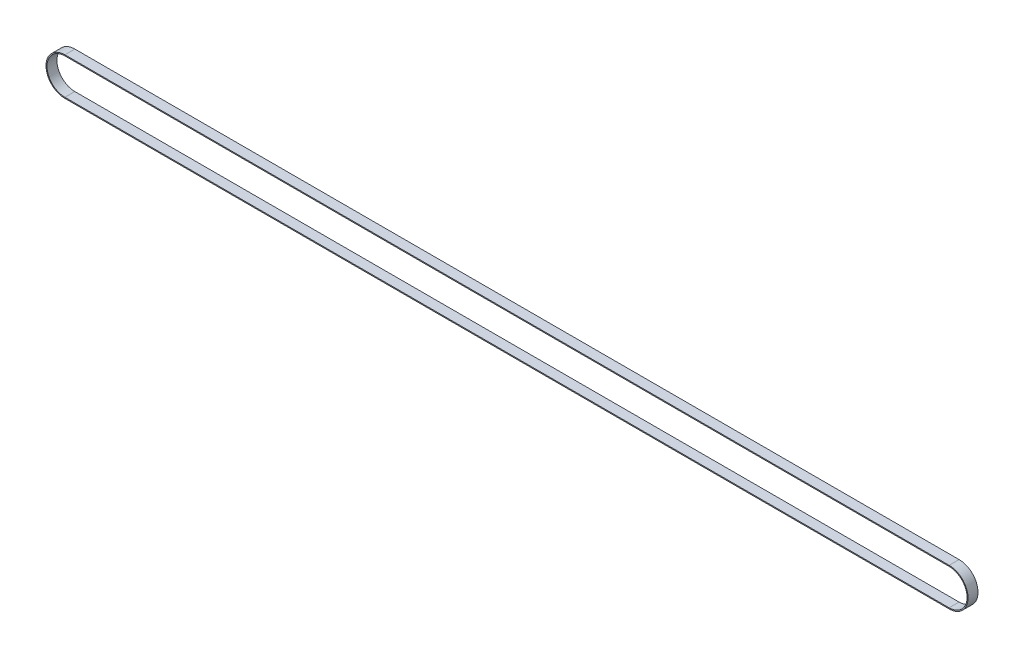
ISO-10303-21;
HEADER;
FILE_DESCRIPTION(('STEP AP214'),'2;1');
FILE_NAME('part.step','',(''),(''),'','','');
FILE_SCHEMA(('AUTOMOTIVE_DESIGN { 1 0 10303 214 1 1 1 1 }'));
ENDSEC;
DATA;
#1=APPLICATION_CONTEXT('core data for automotive mechanical design processes');
#2=APPLICATION_PROTOCOL_DEFINITION('international standard','automotive_design',2000,#1);
#3=PRODUCT_CONTEXT('',#1,'mechanical');
#4=PRODUCT('Part','Part','',(#3));
#5=PRODUCT_RELATED_PRODUCT_CATEGORY('part','',(#4));
#6=PRODUCT_DEFINITION_FORMATION('','',#4);
#7=PRODUCT_DEFINITION_CONTEXT('part definition',#1,'design');
#8=PRODUCT_DEFINITION('design','',#6,#7);
#9=PRODUCT_DEFINITION_SHAPE('','',#8);
#10=(LENGTH_UNIT() NAMED_UNIT(*) SI_UNIT(.MILLI.,.METRE.));
#11=(NAMED_UNIT(*) PLANE_ANGLE_UNIT() SI_UNIT($,.RADIAN.));
#12=(NAMED_UNIT(*) SI_UNIT($,.STERADIAN.) SOLID_ANGLE_UNIT());
#13=UNCERTAINTY_MEASURE_WITH_UNIT(LENGTH_MEASURE(1.E-05),#10,'distance_accuracy_value','');
#14=(GEOMETRIC_REPRESENTATION_CONTEXT(3) GLOBAL_UNCERTAINTY_ASSIGNED_CONTEXT((#13)) GLOBAL_UNIT_ASSIGNED_CONTEXT((#10,
#11,#12)) REPRESENTATION_CONTEXT('',''));
#15=CARTESIAN_POINT('',(0.,0.,0.));
#16=DIRECTION('',(0.,0.,1.));
#17=DIRECTION('',(1.,0.,0.));
#18=AXIS2_PLACEMENT_3D('',#15,#16,#17);
#19=CARTESIAN_POINT('',(0.,0.,10.));
#20=DIRECTION('',(0.,0.,1.));
#21=DIRECTION('',(1.,0.,0.));
#22=AXIS2_PLACEMENT_3D('',#19,#20,#21);
#23=PLANE('',#22);
#24=CARTESIAN_POINT('',(0.,0.,10.));
#25=DIRECTION('',(0.,0.,1.));
#26=DIRECTION('',(1.,0.,0.));
#27=AXIS2_PLACEMENT_3D('',#24,#25,#26);
#28=CIRCLE('',#27,19.);
#29=CARTESIAN_POINT('',(0.,19.,10.));
#30=VERTEX_POINT('',#29);
#31=CARTESIAN_POINT('',(0.,-19.,10.));
#32=VERTEX_POINT('',#31);
#33=EDGE_CURVE('E157',#30,#32,#28,.T.);
#34=ORIENTED_EDGE('',*,*,#33,.T.);
#35=DIRECTION('',(1.,0.,0.));
#36=VECTOR('',#35,1.);
#37=CARTESIAN_POINT('',(0.,-19.,10.));
#38=LINE('',#37,#36);
#39=CARTESIAN_POINT('',(889.,-19.,10.));
#40=VERTEX_POINT('',#39);
#41=EDGE_CURVE('E161',#32,#40,#38,.T.);
#42=ORIENTED_EDGE('',*,*,#41,.T.);
#43=CARTESIAN_POINT('',(889.,0.,10.));
#44=DIRECTION('',(0.,0.,1.));
#45=DIRECTION('',(1.,0.,0.));
#46=AXIS2_PLACEMENT_3D('',#43,#44,#45);
#47=CIRCLE('',#46,19.);
#48=CARTESIAN_POINT('',(889.,19.,10.));
#49=VERTEX_POINT('',#48);
#50=EDGE_CURVE('E165',#40,#49,#47,.T.);
#51=ORIENTED_EDGE('',*,*,#50,.T.);
#52=DIRECTION('',(-1.,0.,0.));
#53=VECTOR('',#52,1.);
#54=CARTESIAN_POINT('',(889.,19.,10.));
#55=LINE('',#54,#53);
#56=EDGE_CURVE('E168',#49,#30,#55,.T.);
#57=ORIENTED_EDGE('',*,*,#56,.T.);
#58=EDGE_LOOP('',(#34,#42,#51,#57));
#59=FACE_BOUND('',#58,.T.);
#60=DIRECTION('',(-1.,0.,0.));
#61=VECTOR('',#60,1.);
#62=CARTESIAN_POINT('',(889.,18.,10.));
#63=LINE('',#62,#61);
#64=CARTESIAN_POINT('',(889.,18.,10.));
#65=VERTEX_POINT('',#64);
#66=CARTESIAN_POINT('',(0.,18.,10.));
#67=VERTEX_POINT('',#66);
#68=EDGE_CURVE('E118',#65,#67,#63,.T.);
#69=ORIENTED_EDGE('',*,*,#68,.F.);
#70=CARTESIAN_POINT('',(889.,0.,10.));
#71=DIRECTION('',(0.,0.,1.));
#72=DIRECTION('',(1.,0.,0.));
#73=AXIS2_PLACEMENT_3D('',#70,#71,#72);
#74=CIRCLE('',#73,18.);
#75=CARTESIAN_POINT('',(889.,-18.,10.));
#76=VERTEX_POINT('',#75);
#77=EDGE_CURVE('E109',#76,#65,#74,.T.);
#78=ORIENTED_EDGE('',*,*,#77,.F.);
#79=DIRECTION('',(1.,0.,0.));
#80=VECTOR('',#79,1.);
#81=CARTESIAN_POINT('',(0.,-18.,10.));
#82=LINE('',#81,#80);
#83=CARTESIAN_POINT('',(0.,-18.,10.));
#84=VERTEX_POINT('',#83);
#85=EDGE_CURVE('E135',#84,#76,#82,.T.);
#86=ORIENTED_EDGE('',*,*,#85,.F.);
#87=CARTESIAN_POINT('',(0.,0.,10.));
#88=DIRECTION('',(0.,0.,1.));
#89=DIRECTION('',(1.,0.,0.));
#90=AXIS2_PLACEMENT_3D('',#87,#88,#89);
#91=CIRCLE('',#90,18.);
#92=EDGE_CURVE('E131',#67,#84,#91,.T.);
#93=ORIENTED_EDGE('',*,*,#92,.F.);
#94=EDGE_LOOP('',(#69,#78,#86,#93));
#95=FACE_BOUND('',#94,.T.);
#96=ADVANCED_FACE('F43',(#59,#95),#23,.T.);
#97=CARTESIAN_POINT('',(0.,0.,0.));
#98=DIRECTION('',(0.,0.,1.));
#99=DIRECTION('',(1.,0.,0.));
#100=AXIS2_PLACEMENT_3D('',#97,#98,#99);
#101=PLANE('',#100);
#102=CARTESIAN_POINT('',(0.,0.,0.));
#103=DIRECTION('',(0.,0.,1.));
#104=DIRECTION('',(1.,0.,0.));
#105=AXIS2_PLACEMENT_3D('',#102,#103,#104);
#106=CIRCLE('',#105,19.);
#107=CARTESIAN_POINT('',(0.,19.,0.));
#108=VERTEX_POINT('',#107);
#109=CARTESIAN_POINT('',(0.,-19.,0.));
#110=VERTEX_POINT('',#109);
#111=EDGE_CURVE('E127',#108,#110,#106,.T.);
#112=ORIENTED_EDGE('',*,*,#111,.F.);
#113=DIRECTION('',(-1.,0.,0.));
#114=VECTOR('',#113,1.);
#115=CARTESIAN_POINT('',(889.,19.,0.));
#116=LINE('',#115,#114);
#117=CARTESIAN_POINT('',(889.,19.,0.));
#118=VERTEX_POINT('',#117);
#119=EDGE_CURVE('E162',#118,#108,#116,.T.);
#120=ORIENTED_EDGE('',*,*,#119,.F.);
#121=CARTESIAN_POINT('',(889.,0.,0.));
#122=DIRECTION('',(0.,0.,1.));
#123=DIRECTION('',(1.,0.,0.));
#124=AXIS2_PLACEMENT_3D('',#121,#122,#123);
#125=CIRCLE('',#124,19.);
#126=CARTESIAN_POINT('',(889.,-19.,0.));
#127=VERTEX_POINT('',#126);
#128=EDGE_CURVE('E178',#127,#118,#125,.T.);
#129=ORIENTED_EDGE('',*,*,#128,.F.);
#130=DIRECTION('',(1.,0.,0.));
#131=VECTOR('',#130,1.);
#132=CARTESIAN_POINT('',(0.,-19.,0.));
#133=LINE('',#132,#131);
#134=EDGE_CURVE('E175',#110,#127,#133,.T.);
#135=ORIENTED_EDGE('',*,*,#134,.F.);
#136=EDGE_LOOP('',(#112,#120,#129,#135));
#137=FACE_BOUND('',#136,.T.);
#138=CARTESIAN_POINT('',(889.,0.,0.));
#139=DIRECTION('',(0.,0.,1.));
#140=DIRECTION('',(1.,0.,0.));
#141=AXIS2_PLACEMENT_3D('',#138,#139,#140);
#142=CIRCLE('',#141,18.);
#143=CARTESIAN_POINT('',(889.,-18.,0.));
#144=VERTEX_POINT('',#143);
#145=CARTESIAN_POINT('',(889.,18.,0.));
#146=VERTEX_POINT('',#145);
#147=EDGE_CURVE('E67',#144,#146,#142,.T.);
#148=ORIENTED_EDGE('',*,*,#147,.T.);
#149=DIRECTION('',(-1.,0.,0.));
#150=VECTOR('',#149,1.);
#151=CARTESIAN_POINT('',(889.,18.,0.));
#152=LINE('',#151,#150);
#153=CARTESIAN_POINT('',(0.,18.,0.));
#154=VERTEX_POINT('',#153);
#155=EDGE_CURVE('E125',#146,#154,#152,.T.);
#156=ORIENTED_EDGE('',*,*,#155,.T.);
#157=CARTESIAN_POINT('',(0.,0.,0.));
#158=DIRECTION('',(0.,0.,1.));
#159=DIRECTION('',(1.,0.,0.));
#160=AXIS2_PLACEMENT_3D('',#157,#158,#159);
#161=CIRCLE('',#160,18.);
#162=CARTESIAN_POINT('',(0.,-18.,0.));
#163=VERTEX_POINT('',#162);
#164=EDGE_CURVE('E144',#154,#163,#161,.T.);
#165=ORIENTED_EDGE('',*,*,#164,.T.);
#166=DIRECTION('',(1.,0.,0.));
#167=VECTOR('',#166,1.);
#168=CARTESIAN_POINT('',(0.,-18.,0.));
#169=LINE('',#168,#167);
#170=EDGE_CURVE('E119',#163,#144,#169,.T.);
#171=ORIENTED_EDGE('',*,*,#170,.T.);
#172=EDGE_LOOP('',(#148,#156,#165,#171));
#173=FACE_BOUND('',#172,.T.);
#174=ADVANCED_FACE('F201',(#137,#173),#101,.F.);
#175=CARTESIAN_POINT('',(0.,0.,10.));
#176=DIRECTION('',(0.,0.,-1.));
#177=DIRECTION('',(-1.,0.,0.));
#178=AXIS2_PLACEMENT_3D('',#175,#176,#177);
#179=CYLINDRICAL_SURFACE('',#178,19.);
#180=ORIENTED_EDGE('',*,*,#111,.T.);
#181=DIRECTION('',(0.,0.,-1.));
#182=VECTOR('',#181,1.);
#183=CARTESIAN_POINT('',(0.,-19.,10.));
#184=LINE('',#183,#182);
#185=EDGE_CURVE('E11',#32,#110,#184,.T.);
#186=ORIENTED_EDGE('',*,*,#185,.F.);
#187=ORIENTED_EDGE('',*,*,#33,.F.);
#188=DIRECTION('',(0.,0.,-1.));
#189=VECTOR('',#188,1.);
#190=CARTESIAN_POINT('',(0.,19.,10.));
#191=LINE('',#190,#189);
#192=EDGE_CURVE('E171',#30,#108,#191,.T.);
#193=ORIENTED_EDGE('',*,*,#192,.T.);
#194=EDGE_LOOP('',(#180,#186,#187,#193));
#195=FACE_BOUND('',#194,.T.);
#196=ADVANCED_FACE('F45',(#195),#179,.T.);
#197=CARTESIAN_POINT('',(0.,-19.,10.));
#198=DIRECTION('',(0.,1.,0.));
#199=DIRECTION('',(-1.,0.,0.));
#200=AXIS2_PLACEMENT_3D('',#197,#198,#199);
#201=PLANE('',#200);
#202=ORIENTED_EDGE('',*,*,#134,.T.);
#203=DIRECTION('',(0.,0.,-1.));
#204=VECTOR('',#203,1.);
#205=CARTESIAN_POINT('',(889.,-19.,10.));
#206=LINE('',#205,#204);
#207=EDGE_CURVE('E52',#40,#127,#206,.T.);
#208=ORIENTED_EDGE('',*,*,#207,.F.);
#209=ORIENTED_EDGE('',*,*,#41,.F.);
#210=ORIENTED_EDGE('',*,*,#185,.T.);
#211=EDGE_LOOP('',(#202,#208,#209,#210));
#212=FACE_BOUND('',#211,.T.);
#213=ADVANCED_FACE('F211',(#212),#201,.F.);
#214=CARTESIAN_POINT('',(889.,0.,10.));
#215=DIRECTION('',(0.,0.,-1.));
#216=DIRECTION('',(-1.,0.,0.));
#217=AXIS2_PLACEMENT_3D('',#214,#215,#216);
#218=CYLINDRICAL_SURFACE('',#217,19.);
#219=ORIENTED_EDGE('',*,*,#128,.T.);
#220=DIRECTION('',(0.,0.,-1.));
#221=VECTOR('',#220,1.);
#222=CARTESIAN_POINT('',(889.,19.,10.));
#223=LINE('',#222,#221);
#224=EDGE_CURVE('E186',#49,#118,#223,.T.);
#225=ORIENTED_EDGE('',*,*,#224,.F.);
#226=ORIENTED_EDGE('',*,*,#50,.F.);
#227=ORIENTED_EDGE('',*,*,#207,.T.);
#228=EDGE_LOOP('',(#219,#225,#226,#227));
#229=FACE_BOUND('',#228,.T.);
#230=ADVANCED_FACE('F195',(#229),#218,.T.);
#231=CARTESIAN_POINT('',(889.,19.,10.));
#232=DIRECTION('',(0.,-1.,0.));
#233=DIRECTION('',(1.,0.,0.));
#234=AXIS2_PLACEMENT_3D('',#231,#232,#233);
#235=PLANE('',#234);
#236=ORIENTED_EDGE('',*,*,#119,.T.);
#237=ORIENTED_EDGE('',*,*,#192,.F.);
#238=ORIENTED_EDGE('',*,*,#56,.F.);
#239=ORIENTED_EDGE('',*,*,#224,.T.);
#240=EDGE_LOOP('',(#236,#237,#238,#239));
#241=FACE_BOUND('',#240,.T.);
#242=ADVANCED_FACE('F205',(#241),#235,.F.);
#243=CARTESIAN_POINT('',(889.,0.,10.));
#244=DIRECTION('',(0.,0.,-1.));
#245=DIRECTION('',(-1.,0.,0.));
#246=AXIS2_PLACEMENT_3D('',#243,#244,#245);
#247=CYLINDRICAL_SURFACE('',#246,18.);
#248=ORIENTED_EDGE('',*,*,#147,.F.);
#249=DIRECTION('',(0.,0.,-1.));
#250=VECTOR('',#249,1.);
#251=CARTESIAN_POINT('',(889.,-18.,10.));
#252=LINE('',#251,#250);
#253=EDGE_CURVE('E113',#76,#144,#252,.T.);
#254=ORIENTED_EDGE('',*,*,#253,.F.);
#255=ORIENTED_EDGE('',*,*,#77,.T.);
#256=DIRECTION('',(0.,0.,-1.));
#257=VECTOR('',#256,1.);
#258=CARTESIAN_POINT('',(889.,18.,10.));
#259=LINE('',#258,#257);
#260=EDGE_CURVE('E112',#65,#146,#259,.T.);
#261=ORIENTED_EDGE('',*,*,#260,.T.);
#262=EDGE_LOOP('',(#248,#254,#255,#261));
#263=FACE_BOUND('',#262,.T.);
#264=ADVANCED_FACE('F111',(#263),#247,.F.);
#265=CARTESIAN_POINT('',(889.,18.,10.));
#266=DIRECTION('',(0.,-1.,0.));
#267=DIRECTION('',(1.,0.,0.));
#268=AXIS2_PLACEMENT_3D('',#265,#266,#267);
#269=PLANE('',#268);
#270=ORIENTED_EDGE('',*,*,#155,.F.);
#271=ORIENTED_EDGE('',*,*,#260,.F.);
#272=ORIENTED_EDGE('',*,*,#68,.T.);
#273=DIRECTION('',(0.,0.,-1.));
#274=VECTOR('',#273,1.);
#275=CARTESIAN_POINT('',(0.,18.,10.));
#276=LINE('',#275,#274);
#277=EDGE_CURVE('E128',#67,#154,#276,.T.);
#278=ORIENTED_EDGE('',*,*,#277,.T.);
#279=EDGE_LOOP('',(#270,#271,#272,#278));
#280=FACE_BOUND('',#279,.T.);
#281=ADVANCED_FACE('F122',(#280),#269,.T.);
#282=CARTESIAN_POINT('',(0.,0.,10.));
#283=DIRECTION('',(0.,0.,-1.));
#284=DIRECTION('',(-1.,0.,0.));
#285=AXIS2_PLACEMENT_3D('',#282,#283,#284);
#286=CYLINDRICAL_SURFACE('',#285,18.);
#287=ORIENTED_EDGE('',*,*,#164,.F.);
#288=ORIENTED_EDGE('',*,*,#277,.F.);
#289=ORIENTED_EDGE('',*,*,#92,.T.);
#290=DIRECTION('',(0.,0.,-1.));
#291=VECTOR('',#290,1.);
#292=CARTESIAN_POINT('',(0.,-18.,10.));
#293=LINE('',#292,#291);
#294=EDGE_CURVE('E59',#84,#163,#293,.T.);
#295=ORIENTED_EDGE('',*,*,#294,.T.);
#296=EDGE_LOOP('',(#287,#288,#289,#295));
#297=FACE_BOUND('',#296,.T.);
#298=ADVANCED_FACE('F234',(#297),#286,.F.);
#299=CARTESIAN_POINT('',(0.,-18.,10.));
#300=DIRECTION('',(0.,1.,0.));
#301=DIRECTION('',(-1.,0.,0.));
#302=AXIS2_PLACEMENT_3D('',#299,#300,#301);
#303=PLANE('',#302);
#304=ORIENTED_EDGE('',*,*,#170,.F.);
#305=ORIENTED_EDGE('',*,*,#294,.F.);
#306=ORIENTED_EDGE('',*,*,#85,.T.);
#307=ORIENTED_EDGE('',*,*,#253,.T.);
#308=EDGE_LOOP('',(#304,#305,#306,#307));
#309=FACE_BOUND('',#308,.T.);
#310=ADVANCED_FACE('F238',(#309),#303,.T.);
#311=CLOSED_SHELL('',(#96,#174,#196,#213,#230,#242,#264,#281,#298,#310));
#312=MANIFOLD_SOLID_BREP('B2',#311);
#313=ADVANCED_BREP_SHAPE_REPRESENTATION('',(#18,#312),#14);
#314=SHAPE_DEFINITION_REPRESENTATION(#9,#313);
ENDSEC;
END-ISO-10303-21;
